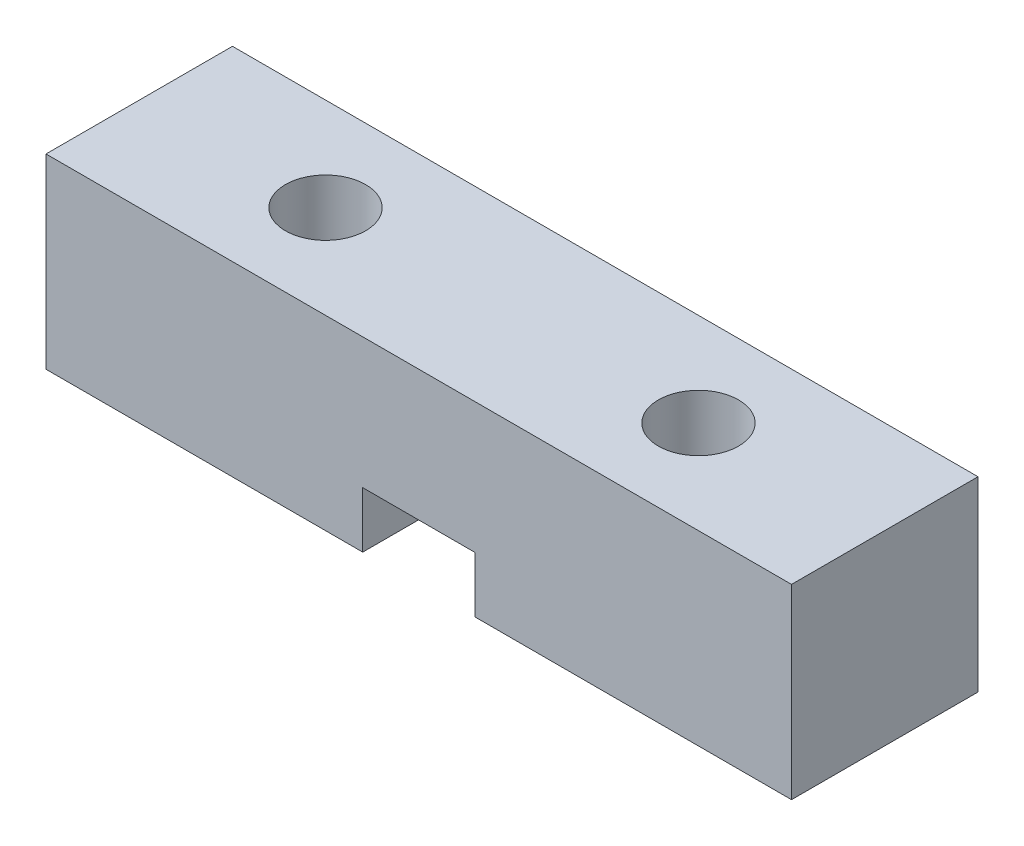
ISO-10303-21;
HEADER;
FILE_DESCRIPTION(('STEP AP214'),'2;1');
FILE_NAME('part.step','',(''),(''),'','','');
FILE_SCHEMA(('AUTOMOTIVE_DESIGN { 1 0 10303 214 1 1 1 1 }'));
ENDSEC;
DATA;
#1=APPLICATION_CONTEXT('core data for automotive mechanical design processes');
#2=APPLICATION_PROTOCOL_DEFINITION('international standard','automotive_design',2000,#1);
#3=PRODUCT_CONTEXT('',#1,'mechanical');
#4=PRODUCT('Part','Part','',(#3));
#5=PRODUCT_RELATED_PRODUCT_CATEGORY('part','',(#4));
#6=PRODUCT_DEFINITION_FORMATION('','',#4);
#7=PRODUCT_DEFINITION_CONTEXT('part definition',#1,'design');
#8=PRODUCT_DEFINITION('design','',#6,#7);
#9=PRODUCT_DEFINITION_SHAPE('','',#8);
#10=(LENGTH_UNIT() NAMED_UNIT(*) SI_UNIT(.MILLI.,.METRE.));
#11=(NAMED_UNIT(*) PLANE_ANGLE_UNIT() SI_UNIT($,.RADIAN.));
#12=(NAMED_UNIT(*) SI_UNIT($,.STERADIAN.) SOLID_ANGLE_UNIT());
#13=UNCERTAINTY_MEASURE_WITH_UNIT(LENGTH_MEASURE(1.E-05),#10,'distance_accuracy_value','');
#14=(GEOMETRIC_REPRESENTATION_CONTEXT(3) GLOBAL_UNCERTAINTY_ASSIGNED_CONTEXT((#13)) GLOBAL_UNIT_ASSIGNED_CONTEXT((#10,
#11,#12)) REPRESENTATION_CONTEXT('',''));
#15=CARTESIAN_POINT('',(0.,0.,0.));
#16=DIRECTION('',(0.,0.,1.));
#17=DIRECTION('',(1.,0.,0.));
#18=AXIS2_PLACEMENT_3D('',#15,#16,#17);
#19=CARTESIAN_POINT('',(0.,29.865,-10.));
#20=DIRECTION('',(0.,-1.,0.));
#21=DIRECTION('',(0.,0.,-1.));
#22=AXIS2_PLACEMENT_3D('',#19,#20,#21);
#23=PLANE('',#22);
#24=CARTESIAN_POINT('',(25.,29.865,-5.));
#25=DIRECTION('',(0.,-1.,0.));
#26=DIRECTION('',(0.,0.,-1.));
#27=AXIS2_PLACEMENT_3D('',#24,#25,#26);
#28=CIRCLE('',#27,2.15);
#29=CARTESIAN_POINT('',(25.,29.865,-7.15));
#30=VERTEX_POINT('',#29);
#31=EDGE_CURVE('E218',#30,#30,#28,.T.);
#32=ORIENTED_EDGE('',*,*,#31,.T.);
#33=EDGE_LOOP('',(#32));
#34=FACE_BOUND('',#33,.T.);
#35=CARTESIAN_POINT('',(45.,29.865,-5.));
#36=DIRECTION('',(0.,-1.,0.));
#37=DIRECTION('',(0.,0.,-1.));
#38=AXIS2_PLACEMENT_3D('',#35,#36,#37);
#39=CIRCLE('',#38,2.15);
#40=CARTESIAN_POINT('',(45.,29.865,-7.15));
#41=VERTEX_POINT('',#40);
#42=EDGE_CURVE('E139',#41,#41,#39,.T.);
#43=ORIENTED_EDGE('',*,*,#42,.T.);
#44=EDGE_LOOP('',(#43));
#45=FACE_BOUND('',#44,.T.);
#46=DIRECTION('',(1.,0.,0.));
#47=VECTOR('',#46,1.);
#48=CARTESIAN_POINT('',(0.,29.865,0.));
#49=LINE('',#48,#47);
#50=CARTESIAN_POINT('',(15.01,29.865,0.));
#51=VERTEX_POINT('',#50);
#52=CARTESIAN_POINT('',(54.99,29.865,0.));
#53=VERTEX_POINT('',#52);
#54=EDGE_CURVE('E136',#51,#53,#49,.T.);
#55=ORIENTED_EDGE('',*,*,#54,.T.);
#56=DIRECTION('',(0.,0.,1.));
#57=VECTOR('',#56,1.);
#58=CARTESIAN_POINT('',(54.99,29.865,-10.));
#59=LINE('',#58,#57);
#60=CARTESIAN_POINT('',(54.99,29.865,-10.));
#61=VERTEX_POINT('',#60);
#62=EDGE_CURVE('E11',#61,#53,#59,.T.);
#63=ORIENTED_EDGE('',*,*,#62,.F.);
#64=DIRECTION('',(1.,0.,0.));
#65=VECTOR('',#64,1.);
#66=CARTESIAN_POINT('',(0.,29.865,-10.));
#67=LINE('',#66,#65);
#68=CARTESIAN_POINT('',(15.01,29.865,-10.));
#69=VERTEX_POINT('',#68);
#70=EDGE_CURVE('E58',#69,#61,#67,.T.);
#71=ORIENTED_EDGE('',*,*,#70,.F.);
#72=DIRECTION('',(0.,0.,1.));
#73=VECTOR('',#72,1.);
#74=CARTESIAN_POINT('',(15.01,29.865,-10.));
#75=LINE('',#74,#73);
#76=EDGE_CURVE('E43',#69,#51,#75,.T.);
#77=ORIENTED_EDGE('',*,*,#76,.T.);
#78=EDGE_LOOP('',(#55,#63,#71,#77));
#79=FACE_BOUND('',#78,.T.);
#80=ADVANCED_FACE('F40',(#34,#45,#79),#23,.F.);
#81=CARTESIAN_POINT('',(54.99,0.,-10.));
#82=DIRECTION('',(1.,0.,0.));
#83=DIRECTION('',(0.,0.,-1.));
#84=AXIS2_PLACEMENT_3D('',#81,#82,#83);
#85=PLANE('',#84);
#86=DIRECTION('',(0.,1.,0.));
#87=VECTOR('',#86,1.);
#88=CARTESIAN_POINT('',(54.99,0.,0.));
#89=LINE('',#88,#87);
#90=CARTESIAN_POINT('',(54.99,19.865,0.));
#91=VERTEX_POINT('',#90);
#92=EDGE_CURVE('E151',#91,#53,#89,.T.);
#93=ORIENTED_EDGE('',*,*,#92,.F.);
#94=DIRECTION('',(0.,0.,1.));
#95=VECTOR('',#94,1.);
#96=CARTESIAN_POINT('',(54.99,19.865,-10.));
#97=LINE('',#96,#95);
#98=CARTESIAN_POINT('',(54.99,19.865,-10.));
#99=VERTEX_POINT('',#98);
#100=EDGE_CURVE('E49',#99,#91,#97,.T.);
#101=ORIENTED_EDGE('',*,*,#100,.F.);
#102=DIRECTION('',(0.,1.,0.));
#103=VECTOR('',#102,1.);
#104=CARTESIAN_POINT('',(54.99,0.,-10.));
#105=LINE('',#104,#103);
#106=EDGE_CURVE('E126',#99,#61,#105,.T.);
#107=ORIENTED_EDGE('',*,*,#106,.T.);
#108=ORIENTED_EDGE('',*,*,#62,.T.);
#109=EDGE_LOOP('',(#93,#101,#107,#108));
#110=FACE_BOUND('',#109,.T.);
#111=ADVANCED_FACE('F171',(#110),#85,.T.);
#112=CARTESIAN_POINT('',(0.,19.865,-10.));
#113=DIRECTION('',(0.,-1.,0.));
#114=DIRECTION('',(0.,0.,-1.));
#115=AXIS2_PLACEMENT_3D('',#112,#113,#114);
#116=PLANE('',#115);
#117=CARTESIAN_POINT('',(45.,19.865,-5.));
#118=DIRECTION('',(0.,-1.,0.));
#119=DIRECTION('',(0.,0.,-1.));
#120=AXIS2_PLACEMENT_3D('',#117,#118,#119);
#121=CIRCLE('',#120,2.15);
#122=CARTESIAN_POINT('',(45.,19.865,-7.15));
#123=VERTEX_POINT('',#122);
#124=EDGE_CURVE('E223',#123,#123,#121,.T.);
#125=ORIENTED_EDGE('',*,*,#124,.F.);
#126=EDGE_LOOP('',(#125));
#127=FACE_BOUND('',#126,.T.);
#128=DIRECTION('',(1.,0.,0.));
#129=VECTOR('',#128,1.);
#130=CARTESIAN_POINT('',(0.,19.865,0.));
#131=LINE('',#130,#129);
#132=CARTESIAN_POINT('',(38.005,19.865,0.));
#133=VERTEX_POINT('',#132);
#134=EDGE_CURVE('E114',#133,#91,#131,.T.);
#135=ORIENTED_EDGE('',*,*,#134,.F.);
#136=DIRECTION('',(0.,0.,1.));
#137=VECTOR('',#136,1.);
#138=CARTESIAN_POINT('',(38.005,19.865,-10.));
#139=LINE('',#138,#137);
#140=CARTESIAN_POINT('',(38.005,19.865,-10.));
#141=VERTEX_POINT('',#140);
#142=EDGE_CURVE('E110',#141,#133,#139,.T.);
#143=ORIENTED_EDGE('',*,*,#142,.F.);
#144=DIRECTION('',(1.,0.,0.));
#145=VECTOR('',#144,1.);
#146=CARTESIAN_POINT('',(0.,19.865,-10.));
#147=LINE('',#146,#145);
#148=EDGE_CURVE('E113',#141,#99,#147,.T.);
#149=ORIENTED_EDGE('',*,*,#148,.T.);
#150=ORIENTED_EDGE('',*,*,#100,.T.);
#151=EDGE_LOOP('',(#135,#143,#149,#150));
#152=FACE_BOUND('',#151,.T.);
#153=ADVANCED_FACE('F112',(#127,#152),#116,.T.);
#154=CARTESIAN_POINT('',(38.005,0.,-10.));
#155=DIRECTION('',(-1.,0.,0.));
#156=DIRECTION('',(0.,0.,1.));
#157=AXIS2_PLACEMENT_3D('',#154,#155,#156);
#158=PLANE('',#157);
#159=DIRECTION('',(0.,-1.,0.));
#160=VECTOR('',#159,1.);
#161=CARTESIAN_POINT('',(38.005,0.,0.));
#162=LINE('',#161,#160);
#163=CARTESIAN_POINT('',(38.005,22.86,0.));
#164=VERTEX_POINT('',#163);
#165=EDGE_CURVE('E148',#164,#133,#162,.T.);
#166=ORIENTED_EDGE('',*,*,#165,.F.);
#167=DIRECTION('',(0.,0.,1.));
#168=VECTOR('',#167,1.);
#169=CARTESIAN_POINT('',(38.005,22.86,-10.));
#170=LINE('',#169,#168);
#171=CARTESIAN_POINT('',(38.005,22.86,-10.));
#172=VERTEX_POINT('',#171);
#173=EDGE_CURVE('E119',#172,#164,#170,.T.);
#174=ORIENTED_EDGE('',*,*,#173,.F.);
#175=DIRECTION('',(0.,-1.,0.));
#176=VECTOR('',#175,1.);
#177=CARTESIAN_POINT('',(38.005,0.,-10.));
#178=LINE('',#177,#176);
#179=EDGE_CURVE('E124',#172,#141,#178,.T.);
#180=ORIENTED_EDGE('',*,*,#179,.T.);
#181=ORIENTED_EDGE('',*,*,#142,.T.);
#182=EDGE_LOOP('',(#166,#174,#180,#181));
#183=FACE_BOUND('',#182,.T.);
#184=ADVANCED_FACE('F128',(#183),#158,.T.);
#185=CARTESIAN_POINT('',(0.,22.86,-10.));
#186=DIRECTION('',(0.,-1.,0.));
#187=DIRECTION('',(0.,0.,-1.));
#188=AXIS2_PLACEMENT_3D('',#185,#186,#187);
#189=PLANE('',#188);
#190=DIRECTION('',(1.,0.,0.));
#191=VECTOR('',#190,1.);
#192=CARTESIAN_POINT('',(0.,22.86,0.));
#193=LINE('',#192,#191);
#194=CARTESIAN_POINT('',(31.995,22.86,0.));
#195=VERTEX_POINT('',#194);
#196=EDGE_CURVE('E145',#195,#164,#193,.T.);
#197=ORIENTED_EDGE('',*,*,#196,.F.);
#198=DIRECTION('',(0.,0.,1.));
#199=VECTOR('',#198,1.);
#200=CARTESIAN_POINT('',(31.995,22.86,-10.));
#201=LINE('',#200,#199);
#202=CARTESIAN_POINT('',(31.995,22.86,-10.));
#203=VERTEX_POINT('',#202);
#204=EDGE_CURVE('E156',#203,#195,#201,.T.);
#205=ORIENTED_EDGE('',*,*,#204,.F.);
#206=DIRECTION('',(1.,0.,0.));
#207=VECTOR('',#206,1.);
#208=CARTESIAN_POINT('',(0.,22.86,-10.));
#209=LINE('',#208,#207);
#210=EDGE_CURVE('E129',#203,#172,#209,.T.);
#211=ORIENTED_EDGE('',*,*,#210,.T.);
#212=ORIENTED_EDGE('',*,*,#173,.T.);
#213=EDGE_LOOP('',(#197,#205,#211,#212));
#214=FACE_BOUND('',#213,.T.);
#215=ADVANCED_FACE('F186',(#214),#189,.T.);
#216=CARTESIAN_POINT('',(31.995,0.,-10.));
#217=DIRECTION('',(-1.,0.,0.));
#218=DIRECTION('',(0.,0.,1.));
#219=AXIS2_PLACEMENT_3D('',#216,#217,#218);
#220=PLANE('',#219);
#221=DIRECTION('',(0.,-1.,0.));
#222=VECTOR('',#221,1.);
#223=CARTESIAN_POINT('',(31.995,0.,0.));
#224=LINE('',#223,#222);
#225=CARTESIAN_POINT('',(31.995,19.865,0.));
#226=VERTEX_POINT('',#225);
#227=EDGE_CURVE('E143',#195,#226,#224,.T.);
#228=ORIENTED_EDGE('',*,*,#227,.T.);
#229=DIRECTION('',(0.,0.,1.));
#230=VECTOR('',#229,1.);
#231=CARTESIAN_POINT('',(31.995,19.865,-10.));
#232=LINE('',#231,#230);
#233=CARTESIAN_POINT('',(31.995,19.865,-10.));
#234=VERTEX_POINT('',#233);
#235=EDGE_CURVE('E158',#234,#226,#232,.T.);
#236=ORIENTED_EDGE('',*,*,#235,.F.);
#237=DIRECTION('',(0.,-1.,0.));
#238=VECTOR('',#237,1.);
#239=CARTESIAN_POINT('',(31.995,0.,-10.));
#240=LINE('',#239,#238);
#241=EDGE_CURVE('E131',#203,#234,#240,.T.);
#242=ORIENTED_EDGE('',*,*,#241,.F.);
#243=ORIENTED_EDGE('',*,*,#204,.T.);
#244=EDGE_LOOP('',(#228,#236,#242,#243));
#245=FACE_BOUND('',#244,.T.);
#246=ADVANCED_FACE('F189',(#245),#220,.F.);
#247=CARTESIAN_POINT('',(0.,19.865,-10.));
#248=DIRECTION('',(0.,1.,0.));
#249=DIRECTION('',(0.,0.,1.));
#250=AXIS2_PLACEMENT_3D('',#247,#248,#249);
#251=PLANE('',#250);
#252=CARTESIAN_POINT('',(25.,19.865,-5.));
#253=DIRECTION('',(0.,-1.,0.));
#254=DIRECTION('',(0.,0.,-1.));
#255=AXIS2_PLACEMENT_3D('',#252,#253,#254);
#256=CIRCLE('',#255,2.15);
#257=CARTESIAN_POINT('',(25.,19.865,-7.15));
#258=VERTEX_POINT('',#257);
#259=EDGE_CURVE('E221',#258,#258,#256,.T.);
#260=ORIENTED_EDGE('',*,*,#259,.F.);
#261=EDGE_LOOP('',(#260));
#262=FACE_BOUND('',#261,.T.);
#263=DIRECTION('',(-1.,0.,0.));
#264=VECTOR('',#263,1.);
#265=CARTESIAN_POINT('',(0.,19.865,0.));
#266=LINE('',#265,#264);
#267=CARTESIAN_POINT('',(15.01,19.865,0.));
#268=VERTEX_POINT('',#267);
#269=EDGE_CURVE('E141',#226,#268,#266,.T.);
#270=ORIENTED_EDGE('',*,*,#269,.T.);
#271=DIRECTION('',(0.,0.,1.));
#272=VECTOR('',#271,1.);
#273=CARTESIAN_POINT('',(15.01,19.865,-10.));
#274=LINE('',#273,#272);
#275=CARTESIAN_POINT('',(15.01,19.865,-10.));
#276=VERTEX_POINT('',#275);
#277=EDGE_CURVE('E160',#276,#268,#274,.T.);
#278=ORIENTED_EDGE('',*,*,#277,.F.);
#279=DIRECTION('',(-1.,0.,0.));
#280=VECTOR('',#279,1.);
#281=CARTESIAN_POINT('',(0.,19.865,-10.));
#282=LINE('',#281,#280);
#283=EDGE_CURVE('E232',#234,#276,#282,.T.);
#284=ORIENTED_EDGE('',*,*,#283,.F.);
#285=ORIENTED_EDGE('',*,*,#235,.T.);
#286=EDGE_LOOP('',(#270,#278,#284,#285));
#287=FACE_BOUND('',#286,.T.);
#288=ADVANCED_FACE('F193',(#262,#287),#251,.F.);
#289=CARTESIAN_POINT('',(15.01,0.,-10.));
#290=DIRECTION('',(1.,0.,0.));
#291=DIRECTION('',(0.,0.,-1.));
#292=AXIS2_PLACEMENT_3D('',#289,#290,#291);
#293=PLANE('',#292);
#294=DIRECTION('',(0.,1.,0.));
#295=VECTOR('',#294,1.);
#296=CARTESIAN_POINT('',(15.01,0.,0.));
#297=LINE('',#296,#295);
#298=EDGE_CURVE('E138',#268,#51,#297,.T.);
#299=ORIENTED_EDGE('',*,*,#298,.T.);
#300=ORIENTED_EDGE('',*,*,#76,.F.);
#301=DIRECTION('',(0.,1.,0.));
#302=VECTOR('',#301,1.);
#303=CARTESIAN_POINT('',(15.01,0.,-10.));
#304=LINE('',#303,#302);
#305=EDGE_CURVE('E97',#276,#69,#304,.T.);
#306=ORIENTED_EDGE('',*,*,#305,.F.);
#307=ORIENTED_EDGE('',*,*,#277,.T.);
#308=EDGE_LOOP('',(#299,#300,#306,#307));
#309=FACE_BOUND('',#308,.T.);
#310=ADVANCED_FACE('F196',(#309),#293,.F.);
#311=CARTESIAN_POINT('',(0.,0.,-10.));
#312=DIRECTION('',(0.,0.,1.));
#313=DIRECTION('',(1.,0.,0.));
#314=AXIS2_PLACEMENT_3D('',#311,#312,#313);
#315=PLANE('',#314);
#316=ORIENTED_EDGE('',*,*,#70,.T.);
#317=ORIENTED_EDGE('',*,*,#106,.F.);
#318=ORIENTED_EDGE('',*,*,#148,.F.);
#319=ORIENTED_EDGE('',*,*,#179,.F.);
#320=ORIENTED_EDGE('',*,*,#210,.F.);
#321=ORIENTED_EDGE('',*,*,#241,.T.);
#322=ORIENTED_EDGE('',*,*,#283,.T.);
#323=ORIENTED_EDGE('',*,*,#305,.T.);
#324=EDGE_LOOP('',(#316,#317,#318,#319,#320,#321,#322,#323));
#325=FACE_BOUND('',#324,.T.);
#326=ADVANCED_FACE('F122',(#325),#315,.F.);
#327=CARTESIAN_POINT('',(0.,0.,0.));
#328=DIRECTION('',(0.,0.,1.));
#329=DIRECTION('',(1.,0.,0.));
#330=AXIS2_PLACEMENT_3D('',#327,#328,#329);
#331=PLANE('',#330);
#332=ORIENTED_EDGE('',*,*,#54,.F.);
#333=ORIENTED_EDGE('',*,*,#298,.F.);
#334=ORIENTED_EDGE('',*,*,#269,.F.);
#335=ORIENTED_EDGE('',*,*,#227,.F.);
#336=ORIENTED_EDGE('',*,*,#196,.T.);
#337=ORIENTED_EDGE('',*,*,#165,.T.);
#338=ORIENTED_EDGE('',*,*,#134,.T.);
#339=ORIENTED_EDGE('',*,*,#92,.T.);
#340=EDGE_LOOP('',(#332,#333,#334,#335,#336,#337,#338,#339));
#341=FACE_BOUND('',#340,.T.);
#342=ADVANCED_FACE('F169',(#341),#331,.T.);
#343=CARTESIAN_POINT('',(45.,19.865,-5.));
#344=DIRECTION('',(0.,-1.,0.));
#345=DIRECTION('',(0.,0.,-1.));
#346=AXIS2_PLACEMENT_3D('',#343,#344,#345);
#347=CYLINDRICAL_SURFACE('',#346,2.15);
#348=ORIENTED_EDGE('',*,*,#42,.F.);
#349=EDGE_LOOP('',(#348));
#350=FACE_BOUND('',#349,.T.);
#351=ORIENTED_EDGE('',*,*,#124,.T.);
#352=EDGE_LOOP('',(#351));
#353=FACE_BOUND('',#352,.T.);
#354=ADVANCED_FACE('F205',(#350,#353),#347,.F.);
#355=CARTESIAN_POINT('',(25.,19.865,-5.));
#356=DIRECTION('',(0.,-1.,0.));
#357=DIRECTION('',(0.,0.,-1.));
#358=AXIS2_PLACEMENT_3D('',#355,#356,#357);
#359=CYLINDRICAL_SURFACE('',#358,2.15);
#360=ORIENTED_EDGE('',*,*,#31,.F.);
#361=EDGE_LOOP('',(#360));
#362=FACE_BOUND('',#361,.T.);
#363=ORIENTED_EDGE('',*,*,#259,.T.);
#364=EDGE_LOOP('',(#363));
#365=FACE_BOUND('',#364,.T.);
#366=ADVANCED_FACE('F209',(#362,#365),#359,.F.);
#367=CLOSED_SHELL('',(#80,#111,#153,#184,#215,#246,#288,#310,#326,#342,#354,#366));
#368=MANIFOLD_SOLID_BREP('B2',#367);
#369=ADVANCED_BREP_SHAPE_REPRESENTATION('',(#18,#368),#14);
#370=SHAPE_DEFINITION_REPRESENTATION(#9,#369);
ENDSEC;
END-ISO-10303-21;
